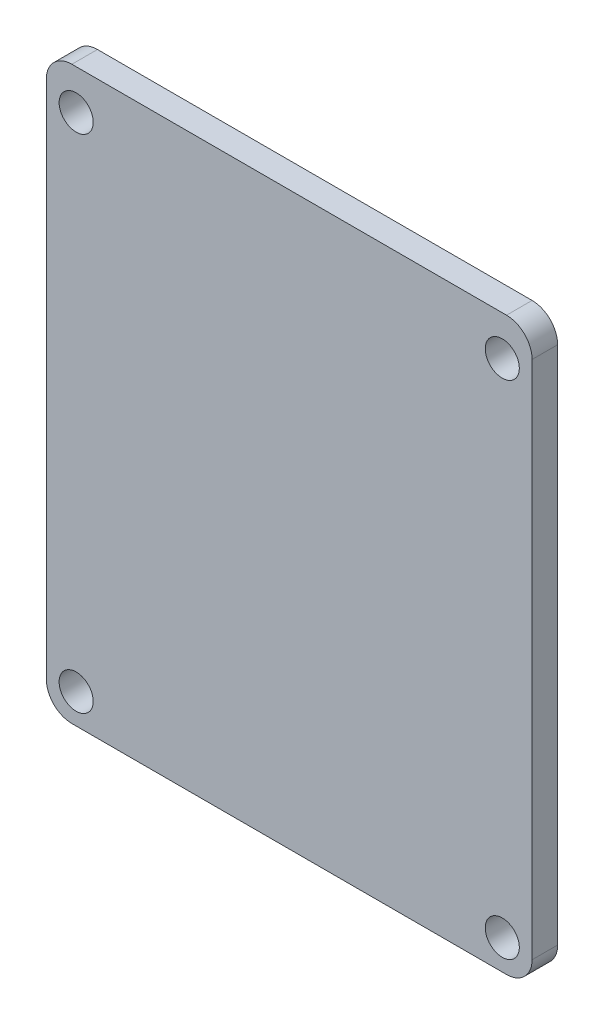
ISO-10303-21;
HEADER;
FILE_DESCRIPTION(('STEP AP214'),'2;1');
FILE_NAME('part.step','',(''),(''),'','','');
FILE_SCHEMA(('AUTOMOTIVE_DESIGN { 1 0 10303 214 1 1 1 1 }'));
ENDSEC;
DATA;
#1=APPLICATION_CONTEXT('core data for automotive mechanical design processes');
#2=APPLICATION_PROTOCOL_DEFINITION('international standard','automotive_design',2000,#1);
#3=PRODUCT_CONTEXT('',#1,'mechanical');
#4=PRODUCT('Part','Part','',(#3));
#5=PRODUCT_RELATED_PRODUCT_CATEGORY('part','',(#4));
#6=PRODUCT_DEFINITION_FORMATION('','',#4);
#7=PRODUCT_DEFINITION_CONTEXT('part definition',#1,'design');
#8=PRODUCT_DEFINITION('design','',#6,#7);
#9=PRODUCT_DEFINITION_SHAPE('','',#8);
#10=(LENGTH_UNIT() NAMED_UNIT(*) SI_UNIT(.MILLI.,.METRE.));
#11=(NAMED_UNIT(*) PLANE_ANGLE_UNIT() SI_UNIT($,.RADIAN.));
#12=(NAMED_UNIT(*) SI_UNIT($,.STERADIAN.) SOLID_ANGLE_UNIT());
#13=UNCERTAINTY_MEASURE_WITH_UNIT(LENGTH_MEASURE(1.E-05),#10,'distance_accuracy_value','');
#14=(GEOMETRIC_REPRESENTATION_CONTEXT(3) GLOBAL_UNCERTAINTY_ASSIGNED_CONTEXT((#13)) GLOBAL_UNIT_ASSIGNED_CONTEXT((#10,
#11,#12)) REPRESENTATION_CONTEXT('',''));
#15=CARTESIAN_POINT('',(0.,0.,0.));
#16=DIRECTION('',(0.,0.,1.));
#17=DIRECTION('',(1.,0.,0.));
#18=AXIS2_PLACEMENT_3D('',#15,#16,#17);
#19=CARTESIAN_POINT('',(0.,0.,3.));
#20=DIRECTION('',(0.,0.,-1.));
#21=DIRECTION('',(-1.,0.,0.));
#22=AXIS2_PLACEMENT_3D('',#19,#20,#21);
#23=PLANE('',#22);
#24=DIRECTION('',(0.,1.,0.));
#25=VECTOR('',#24,1.);
#26=CARTESIAN_POINT('',(57.,0.,3.));
#27=LINE('',#26,#25);
#28=CARTESIAN_POINT('',(57.,3.,3.));
#29=VERTEX_POINT('',#28);
#30=CARTESIAN_POINT('',(57.,64.,3.));
#31=VERTEX_POINT('',#30);
#32=EDGE_CURVE('E229',#29,#31,#27,.T.);
#33=ORIENTED_EDGE('',*,*,#32,.T.);
#34=CARTESIAN_POINT('',(54.,64.,3.));
#35=DIRECTION('',(0.,0.,-1.));
#36=DIRECTION('',(-1.,0.,0.));
#37=AXIS2_PLACEMENT_3D('',#34,#35,#36);
#38=CIRCLE('',#37,3.);
#39=CARTESIAN_POINT('',(54.,67.,3.));
#40=VERTEX_POINT('',#39);
#41=EDGE_CURVE('E267',#31,#40,#38,.F.);
#42=ORIENTED_EDGE('',*,*,#41,.T.);
#43=DIRECTION('',(-1.,0.,0.));
#44=VECTOR('',#43,1.);
#45=CARTESIAN_POINT('',(0.,67.,3.));
#46=LINE('',#45,#44);
#47=CARTESIAN_POINT('',(2.99999999999999,67.,3.));
#48=VERTEX_POINT('',#47);
#49=EDGE_CURVE('E232',#40,#48,#46,.T.);
#50=ORIENTED_EDGE('',*,*,#49,.T.);
#51=CARTESIAN_POINT('',(2.99999999999999,64.,3.));
#52=DIRECTION('',(0.,0.,-1.));
#53=DIRECTION('',(-1.,0.,0.));
#54=AXIS2_PLACEMENT_3D('',#51,#52,#53);
#55=CIRCLE('',#54,3.);
#56=CARTESIAN_POINT('',(0.,64.,3.));
#57=VERTEX_POINT('',#56);
#58=EDGE_CURVE('E265',#48,#57,#55,.F.);
#59=ORIENTED_EDGE('',*,*,#58,.T.);
#60=DIRECTION('',(0.,-1.,0.));
#61=VECTOR('',#60,1.);
#62=CARTESIAN_POINT('',(0.,0.,3.));
#63=LINE('',#62,#61);
#64=CARTESIAN_POINT('',(0.,3.,3.));
#65=VERTEX_POINT('',#64);
#66=EDGE_CURVE('E224',#57,#65,#63,.T.);
#67=ORIENTED_EDGE('',*,*,#66,.T.);
#68=CARTESIAN_POINT('',(3.,3.,3.));
#69=DIRECTION('',(0.,0.,-1.));
#70=DIRECTION('',(-1.,0.,0.));
#71=AXIS2_PLACEMENT_3D('',#68,#69,#70);
#72=CIRCLE('',#71,3.);
#73=CARTESIAN_POINT('',(3.,0.,3.));
#74=VERTEX_POINT('',#73);
#75=EDGE_CURVE('E59',#65,#74,#72,.F.);
#76=ORIENTED_EDGE('',*,*,#75,.T.);
#77=DIRECTION('',(1.,0.,0.));
#78=VECTOR('',#77,1.);
#79=CARTESIAN_POINT('',(0.,0.,3.));
#80=LINE('',#79,#78);
#81=CARTESIAN_POINT('',(54.,0.,3.));
#82=VERTEX_POINT('',#81);
#83=EDGE_CURVE('E226',#74,#82,#80,.T.);
#84=ORIENTED_EDGE('',*,*,#83,.T.);
#85=CARTESIAN_POINT('',(54.,3.,3.));
#86=DIRECTION('',(0.,0.,-1.));
#87=DIRECTION('',(-1.,0.,0.));
#88=AXIS2_PLACEMENT_3D('',#85,#86,#87);
#89=CIRCLE('',#88,3.);
#90=EDGE_CURVE('E262',#82,#29,#89,.F.);
#91=ORIENTED_EDGE('',*,*,#90,.T.);
#92=EDGE_LOOP('',(#33,#42,#50,#59,#67,#76,#84,#91));
#93=FACE_BOUND('',#92,.T.);
#94=CARTESIAN_POINT('',(3.5,62.3501657902684,3.));
#95=DIRECTION('',(0.,0.,1.));
#96=DIRECTION('',(1.,0.,0.));
#97=AXIS2_PLACEMENT_3D('',#94,#95,#96);
#98=CIRCLE('',#97,2.);
#99=CARTESIAN_POINT('',(5.5,62.3501657902684,3.));
#100=VERTEX_POINT('',#99);
#101=EDGE_CURVE('E218',#100,#100,#98,.T.);
#102=ORIENTED_EDGE('',*,*,#101,.F.);
#103=EDGE_LOOP('',(#102));
#104=FACE_BOUND('',#103,.T.);
#105=CARTESIAN_POINT('',(53.5,62.3501657902684,3.));
#106=DIRECTION('',(0.,0.,1.));
#107=DIRECTION('',(1.,0.,0.));
#108=AXIS2_PLACEMENT_3D('',#105,#106,#107);
#109=CIRCLE('',#108,2.);
#110=CARTESIAN_POINT('',(55.5,62.3501657902684,3.));
#111=VERTEX_POINT('',#110);
#112=EDGE_CURVE('E212',#111,#111,#109,.T.);
#113=ORIENTED_EDGE('',*,*,#112,.F.);
#114=EDGE_LOOP('',(#113));
#115=FACE_BOUND('',#114,.T.);
#116=CARTESIAN_POINT('',(53.5,3.5,3.));
#117=DIRECTION('',(0.,0.,1.));
#118=DIRECTION('',(1.,0.,0.));
#119=AXIS2_PLACEMENT_3D('',#116,#117,#118);
#120=CIRCLE('',#119,2.);
#121=CARTESIAN_POINT('',(55.5,3.5,3.));
#122=VERTEX_POINT('',#121);
#123=EDGE_CURVE('E206',#122,#122,#120,.T.);
#124=ORIENTED_EDGE('',*,*,#123,.F.);
#125=EDGE_LOOP('',(#124));
#126=FACE_BOUND('',#125,.T.);
#127=CARTESIAN_POINT('',(3.5,3.5,3.));
#128=DIRECTION('',(0.,0.,1.));
#129=DIRECTION('',(1.,0.,0.));
#130=AXIS2_PLACEMENT_3D('',#127,#128,#129);
#131=CIRCLE('',#130,2.);
#132=CARTESIAN_POINT('',(5.5,3.5,3.));
#133=VERTEX_POINT('',#132);
#134=EDGE_CURVE('E200',#133,#133,#131,.T.);
#135=ORIENTED_EDGE('',*,*,#134,.F.);
#136=EDGE_LOOP('',(#135));
#137=FACE_BOUND('',#136,.T.);
#138=ADVANCED_FACE('F38',(#93,#104,#115,#126,#137),#23,.F.);
#139=CARTESIAN_POINT('',(0.,0.,0.));
#140=DIRECTION('',(0.,0.,-1.));
#141=DIRECTION('',(-1.,0.,0.));
#142=AXIS2_PLACEMENT_3D('',#139,#140,#141);
#143=PLANE('',#142);
#144=DIRECTION('',(1.,0.,0.));
#145=VECTOR('',#144,1.);
#146=CARTESIAN_POINT('',(21.3965882981046,31.3884273724998,0.));
#147=LINE('',#146,#145);
#148=CARTESIAN_POINT('',(21.3965882981046,31.3884273724998,0.));
#149=VERTEX_POINT('',#148);
#150=CARTESIAN_POINT('',(41.3965882981047,31.3884273724998,0.));
#151=VERTEX_POINT('',#150);
#152=EDGE_CURVE('E180',#149,#151,#147,.T.);
#153=ORIENTED_EDGE('',*,*,#152,.T.);
#154=DIRECTION('',(0.,1.,0.));
#155=VECTOR('',#154,1.);
#156=CARTESIAN_POINT('',(41.3965882981047,31.3884273724998,0.));
#157=LINE('',#156,#155);
#158=CARTESIAN_POINT('',(41.3965882981047,33.1832991673716,0.));
#159=VERTEX_POINT('',#158);
#160=EDGE_CURVE('E146',#151,#159,#157,.T.);
#161=ORIENTED_EDGE('',*,*,#160,.T.);
#162=DIRECTION('',(-1.,0.,0.));
#163=VECTOR('',#162,1.);
#164=CARTESIAN_POINT('',(41.3965882981047,33.1832991673716,0.));
#165=LINE('',#164,#163);
#166=CARTESIAN_POINT('',(23.4478703493867,33.1832991673716,0.));
#167=VERTEX_POINT('',#166);
#168=EDGE_CURVE('E183',#159,#167,#165,.T.);
#169=ORIENTED_EDGE('',*,*,#168,.T.);
#170=DIRECTION('',(0.,1.,0.));
#171=VECTOR('',#170,1.);
#172=CARTESIAN_POINT('',(23.4478703493867,33.1832991673716,0.));
#173=LINE('',#172,#171);
#174=CARTESIAN_POINT('',(23.4478703493867,40.8756068596793,0.));
#175=VERTEX_POINT('',#174);
#176=EDGE_CURVE('E185',#167,#175,#173,.T.);
#177=ORIENTED_EDGE('',*,*,#176,.T.);
#178=DIRECTION('',(-1.,0.,0.));
#179=VECTOR('',#178,1.);
#180=CARTESIAN_POINT('',(23.4478703493867,40.8756068596793,0.));
#181=LINE('',#180,#179);
#182=CARTESIAN_POINT('',(21.3965882981046,40.8756068596793,0.));
#183=VERTEX_POINT('',#182);
#184=EDGE_CURVE('E169',#175,#183,#181,.T.);
#185=ORIENTED_EDGE('',*,*,#184,.T.);
#186=DIRECTION('',(0.,-1.,0.));
#187=VECTOR('',#186,1.);
#188=CARTESIAN_POINT('',(21.3965882981046,40.8756068596793,0.));
#189=LINE('',#188,#187);
#190=EDGE_CURVE('E167',#183,#149,#189,.T.);
#191=ORIENTED_EDGE('',*,*,#190,.T.);
#192=EDGE_LOOP('',(#153,#161,#169,#177,#185,#191));
#193=FACE_BOUND('',#192,.T.);
#194=CARTESIAN_POINT('',(53.5,3.5,0.));
#195=DIRECTION('',(0.,0.,1.));
#196=DIRECTION('',(1.,0.,0.));
#197=AXIS2_PLACEMENT_3D('',#194,#195,#196);
#198=CIRCLE('',#197,2.);
#199=CARTESIAN_POINT('',(55.5,3.5,0.));
#200=VERTEX_POINT('',#199);
#201=EDGE_CURVE('E203',#200,#200,#198,.T.);
#202=ORIENTED_EDGE('',*,*,#201,.T.);
#203=EDGE_LOOP('',(#202));
#204=FACE_BOUND('',#203,.T.);
#205=CARTESIAN_POINT('',(3.5,62.3501657902684,0.));
#206=DIRECTION('',(0.,0.,1.));
#207=DIRECTION('',(1.,0.,0.));
#208=AXIS2_PLACEMENT_3D('',#205,#206,#207);
#209=CIRCLE('',#208,2.);
#210=CARTESIAN_POINT('',(5.5,62.3501657902684,0.));
#211=VERTEX_POINT('',#210);
#212=EDGE_CURVE('E215',#211,#211,#209,.T.);
#213=ORIENTED_EDGE('',*,*,#212,.T.);
#214=EDGE_LOOP('',(#213));
#215=FACE_BOUND('',#214,.T.);
#216=DIRECTION('',(-1.,0.,0.));
#217=VECTOR('',#216,1.);
#218=CARTESIAN_POINT('',(0.,67.,0.));
#219=LINE('',#218,#217);
#220=CARTESIAN_POINT('',(54.,67.,0.));
#221=VERTEX_POINT('',#220);
#222=CARTESIAN_POINT('',(2.99999999999999,67.,0.));
#223=VERTEX_POINT('',#222);
#224=EDGE_CURVE('E227',#221,#223,#219,.T.);
#225=ORIENTED_EDGE('',*,*,#224,.F.);
#226=CARTESIAN_POINT('',(54.,64.,0.));
#227=DIRECTION('',(0.,0.,-1.));
#228=DIRECTION('',(-1.,0.,0.));
#229=AXIS2_PLACEMENT_3D('',#226,#227,#228);
#230=CIRCLE('',#229,3.);
#231=CARTESIAN_POINT('',(57.,64.,0.));
#232=VERTEX_POINT('',#231);
#233=EDGE_CURVE('E255',#221,#232,#230,.T.);
#234=ORIENTED_EDGE('',*,*,#233,.T.);
#235=DIRECTION('',(0.,1.,0.));
#236=VECTOR('',#235,1.);
#237=CARTESIAN_POINT('',(57.,0.,0.));
#238=LINE('',#237,#236);
#239=CARTESIAN_POINT('',(57.,3.,0.));
#240=VERTEX_POINT('',#239);
#241=EDGE_CURVE('E240',#240,#232,#238,.T.);
#242=ORIENTED_EDGE('',*,*,#241,.F.);
#243=CARTESIAN_POINT('',(54.,3.,0.));
#244=DIRECTION('',(0.,0.,-1.));
#245=DIRECTION('',(-1.,0.,0.));
#246=AXIS2_PLACEMENT_3D('',#243,#244,#245);
#247=CIRCLE('',#246,3.);
#248=CARTESIAN_POINT('',(54.,0.,0.));
#249=VERTEX_POINT('',#248);
#250=EDGE_CURVE('E249',#240,#249,#247,.T.);
#251=ORIENTED_EDGE('',*,*,#250,.T.);
#252=DIRECTION('',(1.,0.,0.));
#253=VECTOR('',#252,1.);
#254=CARTESIAN_POINT('',(0.,0.,0.));
#255=LINE('',#254,#253);
#256=CARTESIAN_POINT('',(3.,0.,0.));
#257=VERTEX_POINT('',#256);
#258=EDGE_CURVE('E238',#257,#249,#255,.T.);
#259=ORIENTED_EDGE('',*,*,#258,.F.);
#260=CARTESIAN_POINT('',(3.,3.,0.));
#261=DIRECTION('',(0.,0.,-1.));
#262=DIRECTION('',(-1.,0.,0.));
#263=AXIS2_PLACEMENT_3D('',#260,#261,#262);
#264=CIRCLE('',#263,3.);
#265=CARTESIAN_POINT('',(0.,3.,0.));
#266=VERTEX_POINT('',#265);
#267=EDGE_CURVE('E251',#257,#266,#264,.T.);
#268=ORIENTED_EDGE('',*,*,#267,.T.);
#269=DIRECTION('',(0.,-1.,0.));
#270=VECTOR('',#269,1.);
#271=CARTESIAN_POINT('',(0.,0.,0.));
#272=LINE('',#271,#270);
#273=CARTESIAN_POINT('',(0.,64.,0.));
#274=VERTEX_POINT('',#273);
#275=EDGE_CURVE('E221',#274,#266,#272,.T.);
#276=ORIENTED_EDGE('',*,*,#275,.F.);
#277=CARTESIAN_POINT('',(2.99999999999999,64.,0.));
#278=DIRECTION('',(0.,0.,-1.));
#279=DIRECTION('',(-1.,0.,0.));
#280=AXIS2_PLACEMENT_3D('',#277,#278,#279);
#281=CIRCLE('',#280,3.);
#282=EDGE_CURVE('E253',#274,#223,#281,.T.);
#283=ORIENTED_EDGE('',*,*,#282,.T.);
#284=EDGE_LOOP('',(#225,#234,#242,#251,#259,#268,#276,#283));
#285=FACE_BOUND('',#284,.T.);
#286=CARTESIAN_POINT('',(53.5,62.3501657902684,0.));
#287=DIRECTION('',(0.,0.,1.));
#288=DIRECTION('',(1.,0.,0.));
#289=AXIS2_PLACEMENT_3D('',#286,#287,#288);
#290=CIRCLE('',#289,2.);
#291=CARTESIAN_POINT('',(55.5,62.3501657902684,0.));
#292=VERTEX_POINT('',#291);
#293=EDGE_CURVE('E209',#292,#292,#290,.T.);
#294=ORIENTED_EDGE('',*,*,#293,.T.);
#295=EDGE_LOOP('',(#294));
#296=FACE_BOUND('',#295,.T.);
#297=CARTESIAN_POINT('',(3.5,3.5,0.));
#298=DIRECTION('',(0.,0.,1.));
#299=DIRECTION('',(1.,0.,0.));
#300=AXIS2_PLACEMENT_3D('',#297,#298,#299);
#301=CIRCLE('',#300,2.);
#302=CARTESIAN_POINT('',(5.5,3.5,0.));
#303=VERTEX_POINT('',#302);
#304=EDGE_CURVE('E189',#303,#303,#301,.T.);
#305=ORIENTED_EDGE('',*,*,#304,.T.);
#306=EDGE_LOOP('',(#305));
#307=FACE_BOUND('',#306,.T.);
#308=ADVANCED_FACE('F283',(#193,#204,#215,#285,#296,#307),#143,.T.);
#309=CARTESIAN_POINT('',(0.,0.,3.));
#310=DIRECTION('',(1.,0.,0.));
#311=DIRECTION('',(0.,1.,0.));
#312=AXIS2_PLACEMENT_3D('',#309,#310,#311);
#313=PLANE('',#312);
#314=ORIENTED_EDGE('',*,*,#66,.F.);
#315=DIRECTION('',(0.,0.,-1.));
#316=VECTOR('',#315,1.);
#317=CARTESIAN_POINT('',(0.,64.,3.));
#318=LINE('',#317,#316);
#319=EDGE_CURVE('E271',#57,#274,#318,.T.);
#320=ORIENTED_EDGE('',*,*,#319,.T.);
#321=ORIENTED_EDGE('',*,*,#275,.T.);
#322=DIRECTION('',(0.,0.,-1.));
#323=VECTOR('',#322,1.);
#324=CARTESIAN_POINT('',(0.,3.,3.));
#325=LINE('',#324,#323);
#326=EDGE_CURVE('E269',#266,#65,#325,.F.);
#327=ORIENTED_EDGE('',*,*,#326,.T.);
#328=EDGE_LOOP('',(#314,#320,#321,#327));
#329=FACE_BOUND('',#328,.T.);
#330=ADVANCED_FACE('F277',(#329),#313,.F.);
#331=CARTESIAN_POINT('',(0.,0.,3.));
#332=DIRECTION('',(0.,1.,0.));
#333=DIRECTION('',(0.,0.,1.));
#334=AXIS2_PLACEMENT_3D('',#331,#332,#333);
#335=PLANE('',#334);
#336=ORIENTED_EDGE('',*,*,#83,.F.);
#337=DIRECTION('',(0.,0.,-1.));
#338=VECTOR('',#337,1.);
#339=CARTESIAN_POINT('',(3.,0.,3.));
#340=LINE('',#339,#338);
#341=EDGE_CURVE('E11',#74,#257,#340,.T.);
#342=ORIENTED_EDGE('',*,*,#341,.T.);
#343=ORIENTED_EDGE('',*,*,#258,.T.);
#344=DIRECTION('',(0.,0.,-1.));
#345=VECTOR('',#344,1.);
#346=CARTESIAN_POINT('',(54.,0.,3.));
#347=LINE('',#346,#345);
#348=EDGE_CURVE('E46',#249,#82,#347,.F.);
#349=ORIENTED_EDGE('',*,*,#348,.T.);
#350=EDGE_LOOP('',(#336,#342,#343,#349));
#351=FACE_BOUND('',#350,.T.);
#352=ADVANCED_FACE('F289',(#351),#335,.F.);
#353=CARTESIAN_POINT('',(57.,0.,3.));
#354=DIRECTION('',(-1.,0.,0.));
#355=DIRECTION('',(0.,0.,1.));
#356=AXIS2_PLACEMENT_3D('',#353,#354,#355);
#357=PLANE('',#356);
#358=ORIENTED_EDGE('',*,*,#241,.T.);
#359=DIRECTION('',(0.,0.,-1.));
#360=VECTOR('',#359,1.);
#361=CARTESIAN_POINT('',(57.,64.,3.));
#362=LINE('',#361,#360);
#363=EDGE_CURVE('E260',#232,#31,#362,.F.);
#364=ORIENTED_EDGE('',*,*,#363,.T.);
#365=ORIENTED_EDGE('',*,*,#32,.F.);
#366=DIRECTION('',(0.,0.,-1.));
#367=VECTOR('',#366,1.);
#368=CARTESIAN_POINT('',(57.,3.,3.));
#369=LINE('',#368,#367);
#370=EDGE_CURVE('E257',#29,#240,#369,.T.);
#371=ORIENTED_EDGE('',*,*,#370,.T.);
#372=EDGE_LOOP('',(#358,#364,#365,#371));
#373=FACE_BOUND('',#372,.T.);
#374=ADVANCED_FACE('F297',(#373),#357,.F.);
#375=CARTESIAN_POINT('',(0.,67.,3.));
#376=DIRECTION('',(0.,-1.,0.));
#377=DIRECTION('',(0.,0.,-1.));
#378=AXIS2_PLACEMENT_3D('',#375,#376,#377);
#379=PLANE('',#378);
#380=ORIENTED_EDGE('',*,*,#49,.F.);
#381=DIRECTION('',(0.,0.,-1.));
#382=VECTOR('',#381,1.);
#383=CARTESIAN_POINT('',(54.,67.,3.));
#384=LINE('',#383,#382);
#385=EDGE_CURVE('E246',#40,#221,#384,.T.);
#386=ORIENTED_EDGE('',*,*,#385,.T.);
#387=ORIENTED_EDGE('',*,*,#224,.T.);
#388=DIRECTION('',(0.,0.,-1.));
#389=VECTOR('',#388,1.);
#390=CARTESIAN_POINT('',(2.99999999999999,67.,3.));
#391=LINE('',#390,#389);
#392=EDGE_CURVE('E235',#223,#48,#391,.F.);
#393=ORIENTED_EDGE('',*,*,#392,.T.);
#394=EDGE_LOOP('',(#380,#386,#387,#393));
#395=FACE_BOUND('',#394,.T.);
#396=ADVANCED_FACE('F305',(#395),#379,.F.);
#397=CARTESIAN_POINT('',(3.5,62.3501657902684,3.));
#398=DIRECTION('',(0.,0.,-1.));
#399=DIRECTION('',(-1.,0.,0.));
#400=AXIS2_PLACEMENT_3D('',#397,#398,#399);
#401=CYLINDRICAL_SURFACE('',#400,2.);
#402=ORIENTED_EDGE('',*,*,#101,.T.);
#403=EDGE_LOOP('',(#402));
#404=FACE_BOUND('',#403,.T.);
#405=ORIENTED_EDGE('',*,*,#212,.F.);
#406=EDGE_LOOP('',(#405));
#407=FACE_BOUND('',#406,.T.);
#408=ADVANCED_FACE('F323',(#404,#407),#401,.F.);
#409=CARTESIAN_POINT('',(53.5,62.3501657902684,3.));
#410=DIRECTION('',(0.,0.,-1.));
#411=DIRECTION('',(-1.,0.,0.));
#412=AXIS2_PLACEMENT_3D('',#409,#410,#411);
#413=CYLINDRICAL_SURFACE('',#412,2.);
#414=ORIENTED_EDGE('',*,*,#112,.T.);
#415=EDGE_LOOP('',(#414));
#416=FACE_BOUND('',#415,.T.);
#417=ORIENTED_EDGE('',*,*,#293,.F.);
#418=EDGE_LOOP('',(#417));
#419=FACE_BOUND('',#418,.T.);
#420=ADVANCED_FACE('F356',(#416,#419),#413,.F.);
#421=CARTESIAN_POINT('',(53.5,3.5,3.));
#422=DIRECTION('',(0.,0.,-1.));
#423=DIRECTION('',(-1.,0.,0.));
#424=AXIS2_PLACEMENT_3D('',#421,#422,#423);
#425=CYLINDRICAL_SURFACE('',#424,2.);
#426=ORIENTED_EDGE('',*,*,#123,.T.);
#427=EDGE_LOOP('',(#426));
#428=FACE_BOUND('',#427,.T.);
#429=ORIENTED_EDGE('',*,*,#201,.F.);
#430=EDGE_LOOP('',(#429));
#431=FACE_BOUND('',#430,.T.);
#432=ADVANCED_FACE('F363',(#428,#431),#425,.F.);
#433=CARTESIAN_POINT('',(3.5,3.5,3.));
#434=DIRECTION('',(0.,0.,-1.));
#435=DIRECTION('',(-1.,0.,0.));
#436=AXIS2_PLACEMENT_3D('',#433,#434,#435);
#437=CYLINDRICAL_SURFACE('',#436,2.);
#438=ORIENTED_EDGE('',*,*,#134,.T.);
#439=EDGE_LOOP('',(#438));
#440=FACE_BOUND('',#439,.T.);
#441=ORIENTED_EDGE('',*,*,#304,.F.);
#442=EDGE_LOOP('',(#441));
#443=FACE_BOUND('',#442,.T.);
#444=ADVANCED_FACE('F370',(#440,#443),#437,.F.);
#445=CARTESIAN_POINT('',(21.3965882981046,31.3884273724998,-1.));
#446=DIRECTION('',(0.,-1.,0.));
#447=DIRECTION('',(0.,0.,-1.));
#448=AXIS2_PLACEMENT_3D('',#445,#446,#447);
#449=PLANE('',#448);
#450=ORIENTED_EDGE('',*,*,#152,.F.);
#451=DIRECTION('',(0.,0.,1.));
#452=VECTOR('',#451,1.);
#453=CARTESIAN_POINT('',(21.3965882981046,31.3884273724998,-1.));
#454=LINE('',#453,#452);
#455=CARTESIAN_POINT('',(21.3965882981046,31.3884273724998,-1.));
#456=VERTEX_POINT('',#455);
#457=EDGE_CURVE('E166',#456,#149,#454,.T.);
#458=ORIENTED_EDGE('',*,*,#457,.F.);
#459=DIRECTION('',(1.,0.,0.));
#460=VECTOR('',#459,1.);
#461=CARTESIAN_POINT('',(21.3965882981046,31.3884273724998,-1.));
#462=LINE('',#461,#460);
#463=CARTESIAN_POINT('',(41.3965882981047,31.3884273724998,-1.));
#464=VERTEX_POINT('',#463);
#465=EDGE_CURVE('E158',#456,#464,#462,.T.);
#466=ORIENTED_EDGE('',*,*,#465,.T.);
#467=DIRECTION('',(0.,0.,1.));
#468=VECTOR('',#467,1.);
#469=CARTESIAN_POINT('',(41.3965882981047,31.3884273724998,-1.));
#470=LINE('',#469,#468);
#471=EDGE_CURVE('E141',#464,#151,#470,.T.);
#472=ORIENTED_EDGE('',*,*,#471,.T.);
#473=EDGE_LOOP('',(#450,#458,#466,#472));
#474=FACE_BOUND('',#473,.T.);
#475=ADVANCED_FACE('F164',(#474),#449,.T.);
#476=CARTESIAN_POINT('',(21.3965882981046,40.8756068596793,-1.));
#477=DIRECTION('',(-1.,0.,0.));
#478=DIRECTION('',(0.,0.,1.));
#479=AXIS2_PLACEMENT_3D('',#476,#477,#478);
#480=PLANE('',#479);
#481=ORIENTED_EDGE('',*,*,#190,.F.);
#482=DIRECTION('',(0.,0.,1.));
#483=VECTOR('',#482,1.);
#484=CARTESIAN_POINT('',(21.3965882981046,40.8756068596793,-1.));
#485=LINE('',#484,#483);
#486=CARTESIAN_POINT('',(21.3965882981046,40.8756068596793,-1.));
#487=VERTEX_POINT('',#486);
#488=EDGE_CURVE('E190',#487,#183,#485,.T.);
#489=ORIENTED_EDGE('',*,*,#488,.F.);
#490=DIRECTION('',(0.,-1.,0.));
#491=VECTOR('',#490,1.);
#492=CARTESIAN_POINT('',(21.3965882981046,40.8756068596793,-1.));
#493=LINE('',#492,#491);
#494=EDGE_CURVE('E151',#487,#456,#493,.T.);
#495=ORIENTED_EDGE('',*,*,#494,.T.);
#496=ORIENTED_EDGE('',*,*,#457,.T.);
#497=EDGE_LOOP('',(#481,#489,#495,#496));
#498=FACE_BOUND('',#497,.T.);
#499=ADVANCED_FACE('F385',(#498),#480,.T.);
#500=CARTESIAN_POINT('',(23.4478703493867,40.8756068596793,-1.));
#501=DIRECTION('',(0.,1.,0.));
#502=DIRECTION('',(0.,0.,1.));
#503=AXIS2_PLACEMENT_3D('',#500,#501,#502);
#504=PLANE('',#503);
#505=ORIENTED_EDGE('',*,*,#184,.F.);
#506=DIRECTION('',(0.,0.,1.));
#507=VECTOR('',#506,1.);
#508=CARTESIAN_POINT('',(23.4478703493867,40.8756068596793,-1.));
#509=LINE('',#508,#507);
#510=CARTESIAN_POINT('',(23.4478703493867,40.8756068596793,-1.));
#511=VERTEX_POINT('',#510);
#512=EDGE_CURVE('E193',#511,#175,#509,.T.);
#513=ORIENTED_EDGE('',*,*,#512,.F.);
#514=DIRECTION('',(-1.,0.,0.));
#515=VECTOR('',#514,1.);
#516=CARTESIAN_POINT('',(23.4478703493867,40.8756068596793,-1.));
#517=LINE('',#516,#515);
#518=EDGE_CURVE('E176',#511,#487,#517,.T.);
#519=ORIENTED_EDGE('',*,*,#518,.T.);
#520=ORIENTED_EDGE('',*,*,#488,.T.);
#521=EDGE_LOOP('',(#505,#513,#519,#520));
#522=FACE_BOUND('',#521,.T.);
#523=ADVANCED_FACE('F392',(#522),#504,.T.);
#524=CARTESIAN_POINT('',(23.4478703493867,33.1832991673716,-1.));
#525=DIRECTION('',(1.,0.,0.));
#526=DIRECTION('',(0.,0.,-1.));
#527=AXIS2_PLACEMENT_3D('',#524,#525,#526);
#528=PLANE('',#527);
#529=ORIENTED_EDGE('',*,*,#176,.F.);
#530=DIRECTION('',(0.,0.,1.));
#531=VECTOR('',#530,1.);
#532=CARTESIAN_POINT('',(23.4478703493867,33.1832991673716,-1.));
#533=LINE('',#532,#531);
#534=CARTESIAN_POINT('',(23.4478703493867,33.1832991673716,-1.));
#535=VERTEX_POINT('',#534);
#536=EDGE_CURVE('E196',#535,#167,#533,.T.);
#537=ORIENTED_EDGE('',*,*,#536,.F.);
#538=DIRECTION('',(0.,1.,0.));
#539=VECTOR('',#538,1.);
#540=CARTESIAN_POINT('',(23.4478703493867,33.1832991673716,-1.));
#541=LINE('',#540,#539);
#542=EDGE_CURVE('E173',#535,#511,#541,.T.);
#543=ORIENTED_EDGE('',*,*,#542,.T.);
#544=ORIENTED_EDGE('',*,*,#512,.T.);
#545=EDGE_LOOP('',(#529,#537,#543,#544));
#546=FACE_BOUND('',#545,.T.);
#547=ADVANCED_FACE('F400',(#546),#528,.T.);
#548=CARTESIAN_POINT('',(41.3965882981047,33.1832991673716,-1.));
#549=DIRECTION('',(0.,1.,0.));
#550=DIRECTION('',(0.,0.,1.));
#551=AXIS2_PLACEMENT_3D('',#548,#549,#550);
#552=PLANE('',#551);
#553=ORIENTED_EDGE('',*,*,#168,.F.);
#554=DIRECTION('',(0.,0.,1.));
#555=VECTOR('',#554,1.);
#556=CARTESIAN_POINT('',(41.3965882981047,33.1832991673716,-1.));
#557=LINE('',#556,#555);
#558=CARTESIAN_POINT('',(41.3965882981047,33.1832991673716,-1.));
#559=VERTEX_POINT('',#558);
#560=EDGE_CURVE('E150',#559,#159,#557,.T.);
#561=ORIENTED_EDGE('',*,*,#560,.F.);
#562=DIRECTION('',(-1.,0.,0.));
#563=VECTOR('',#562,1.);
#564=CARTESIAN_POINT('',(41.3965882981047,33.1832991673716,-1.));
#565=LINE('',#564,#563);
#566=EDGE_CURVE('E162',#559,#535,#565,.T.);
#567=ORIENTED_EDGE('',*,*,#566,.T.);
#568=ORIENTED_EDGE('',*,*,#536,.T.);
#569=EDGE_LOOP('',(#553,#561,#567,#568));
#570=FACE_BOUND('',#569,.T.);
#571=ADVANCED_FACE('F408',(#570),#552,.T.);
#572=CARTESIAN_POINT('',(41.3965882981047,31.3884273724998,-1.));
#573=DIRECTION('',(1.,0.,0.));
#574=DIRECTION('',(0.,0.,-1.));
#575=AXIS2_PLACEMENT_3D('',#572,#573,#574);
#576=PLANE('',#575);
#577=ORIENTED_EDGE('',*,*,#160,.F.);
#578=ORIENTED_EDGE('',*,*,#471,.F.);
#579=DIRECTION('',(0.,1.,0.));
#580=VECTOR('',#579,1.);
#581=CARTESIAN_POINT('',(41.3965882981047,31.3884273724998,-1.));
#582=LINE('',#581,#580);
#583=EDGE_CURVE('E145',#464,#559,#582,.T.);
#584=ORIENTED_EDGE('',*,*,#583,.T.);
#585=ORIENTED_EDGE('',*,*,#560,.T.);
#586=EDGE_LOOP('',(#577,#578,#584,#585));
#587=FACE_BOUND('',#586,.T.);
#588=ADVANCED_FACE('F143',(#587),#576,.T.);
#589=CARTESIAN_POINT('',(0.,0.,-1.));
#590=DIRECTION('',(0.,0.,1.));
#591=DIRECTION('',(1.,0.,0.));
#592=AXIS2_PLACEMENT_3D('',#589,#590,#591);
#593=PLANE('',#592);
#594=ORIENTED_EDGE('',*,*,#465,.F.);
#595=ORIENTED_EDGE('',*,*,#494,.F.);
#596=ORIENTED_EDGE('',*,*,#518,.F.);
#597=ORIENTED_EDGE('',*,*,#542,.F.);
#598=ORIENTED_EDGE('',*,*,#566,.F.);
#599=ORIENTED_EDGE('',*,*,#583,.F.);
#600=EDGE_LOOP('',(#594,#595,#596,#597,#598,#599));
#601=FACE_BOUND('',#600,.T.);
#602=ADVANCED_FACE('F156',(#601),#593,.F.);
#603=CARTESIAN_POINT('',(54.,64.,3.));
#604=DIRECTION('',(0.,0.,-1.));
#605=DIRECTION('',(-1.,0.,0.));
#606=AXIS2_PLACEMENT_3D('',#603,#604,#605);
#607=CYLINDRICAL_SURFACE('',#606,3.);
#608=ORIENTED_EDGE('',*,*,#41,.F.);
#609=ORIENTED_EDGE('',*,*,#363,.F.);
#610=ORIENTED_EDGE('',*,*,#233,.F.);
#611=ORIENTED_EDGE('',*,*,#385,.F.);
#612=EDGE_LOOP('',(#608,#609,#610,#611));
#613=FACE_BOUND('',#612,.T.);
#614=ADVANCED_FACE('F302',(#613),#607,.T.);
#615=CARTESIAN_POINT('',(2.99999999999999,64.,3.));
#616=DIRECTION('',(0.,0.,-1.));
#617=DIRECTION('',(-1.,0.,0.));
#618=AXIS2_PLACEMENT_3D('',#615,#616,#617);
#619=CYLINDRICAL_SURFACE('',#618,3.);
#620=ORIENTED_EDGE('',*,*,#58,.F.);
#621=ORIENTED_EDGE('',*,*,#392,.F.);
#622=ORIENTED_EDGE('',*,*,#282,.F.);
#623=ORIENTED_EDGE('',*,*,#319,.F.);
#624=EDGE_LOOP('',(#620,#621,#622,#623));
#625=FACE_BOUND('',#624,.T.);
#626=ADVANCED_FACE('F307',(#625),#619,.T.);
#627=CARTESIAN_POINT('',(3.,3.,3.));
#628=DIRECTION('',(0.,0.,-1.));
#629=DIRECTION('',(-1.,0.,0.));
#630=AXIS2_PLACEMENT_3D('',#627,#628,#629);
#631=CYLINDRICAL_SURFACE('',#630,3.);
#632=ORIENTED_EDGE('',*,*,#75,.F.);
#633=ORIENTED_EDGE('',*,*,#326,.F.);
#634=ORIENTED_EDGE('',*,*,#267,.F.);
#635=ORIENTED_EDGE('',*,*,#341,.F.);
#636=EDGE_LOOP('',(#632,#633,#634,#635));
#637=FACE_BOUND('',#636,.T.);
#638=ADVANCED_FACE('F288',(#637),#631,.T.);
#639=CARTESIAN_POINT('',(54.,3.,3.));
#640=DIRECTION('',(0.,0.,-1.));
#641=DIRECTION('',(-1.,0.,0.));
#642=AXIS2_PLACEMENT_3D('',#639,#640,#641);
#643=CYLINDRICAL_SURFACE('',#642,3.);
#644=ORIENTED_EDGE('',*,*,#90,.F.);
#645=ORIENTED_EDGE('',*,*,#348,.F.);
#646=ORIENTED_EDGE('',*,*,#250,.F.);
#647=ORIENTED_EDGE('',*,*,#370,.F.);
#648=EDGE_LOOP('',(#644,#645,#646,#647));
#649=FACE_BOUND('',#648,.T.);
#650=ADVANCED_FACE('F40',(#649),#643,.T.);
#651=CLOSED_SHELL('',(#138,#308,#330,#352,#374,#396,#408,#420,#432,#444,#475,#499,#523,#547,
#571,#588,#602,#614,#626,#638,#650));
#652=MANIFOLD_SOLID_BREP('B2',#651);
#653=ADVANCED_BREP_SHAPE_REPRESENTATION('',(#18,#652),#14);
#654=SHAPE_DEFINITION_REPRESENTATION(#9,#653);
ENDSEC;
END-ISO-10303-21;
